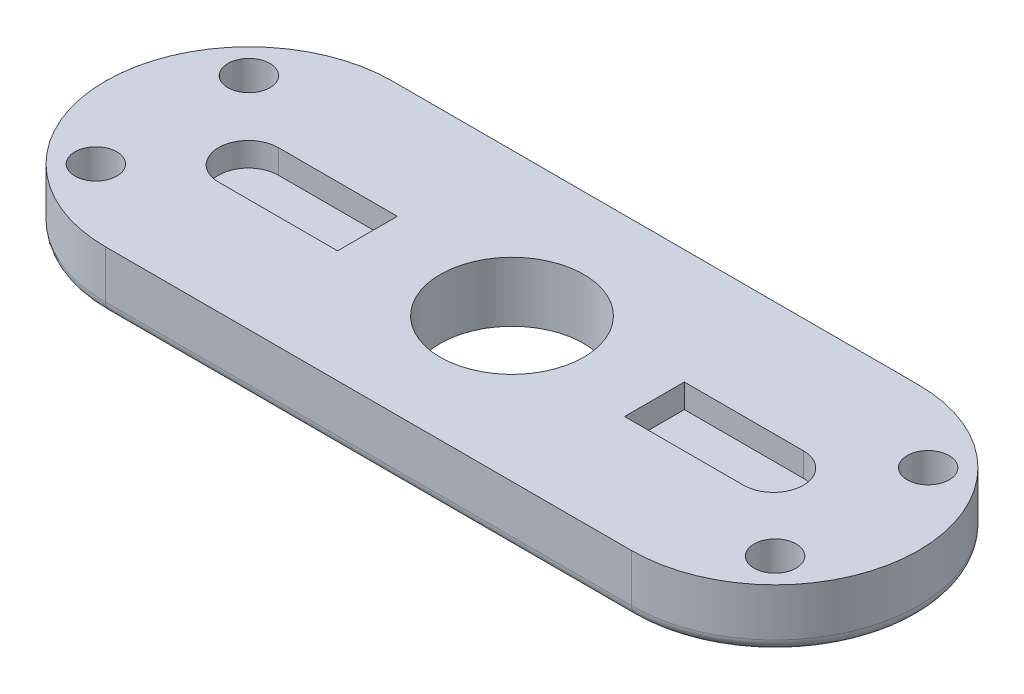
ISO-10303-21;
HEADER;
FILE_DESCRIPTION(('STEP AP214'),'2;1');
FILE_NAME('part.step','',(''),(''),'','','');
FILE_SCHEMA(('AUTOMOTIVE_DESIGN { 1 0 10303 214 1 1 1 1 }'));
ENDSEC;
DATA;
#1=APPLICATION_CONTEXT('core data for automotive mechanical design processes');
#2=APPLICATION_PROTOCOL_DEFINITION('international standard','automotive_design',2000,#1);
#3=PRODUCT_CONTEXT('',#1,'mechanical');
#4=PRODUCT('Part','Part','',(#3));
#5=PRODUCT_RELATED_PRODUCT_CATEGORY('part','',(#4));
#6=PRODUCT_DEFINITION_FORMATION('','',#4);
#7=PRODUCT_DEFINITION_CONTEXT('part definition',#1,'design');
#8=PRODUCT_DEFINITION('design','',#6,#7);
#9=PRODUCT_DEFINITION_SHAPE('','',#8);
#10=(LENGTH_UNIT() NAMED_UNIT(*) SI_UNIT(.MILLI.,.METRE.));
#11=(NAMED_UNIT(*) PLANE_ANGLE_UNIT() SI_UNIT($,.RADIAN.));
#12=(NAMED_UNIT(*) SI_UNIT($,.STERADIAN.) SOLID_ANGLE_UNIT());
#13=UNCERTAINTY_MEASURE_WITH_UNIT(LENGTH_MEASURE(1.E-05),#10,'distance_accuracy_value','');
#14=(GEOMETRIC_REPRESENTATION_CONTEXT(3) GLOBAL_UNCERTAINTY_ASSIGNED_CONTEXT((#13)) GLOBAL_UNIT_ASSIGNED_CONTEXT((#10,
#11,#12)) REPRESENTATION_CONTEXT('',''));
#15=CARTESIAN_POINT('',(0.,0.,0.));
#16=DIRECTION('',(0.,0.,1.));
#17=DIRECTION('',(1.,0.,0.));
#18=AXIS2_PLACEMENT_3D('',#15,#16,#17);
#19=CARTESIAN_POINT('',(-27.94,6.35,0.));
#20=DIRECTION('',(0.,-1.,0.));
#21=DIRECTION('',(0.,0.,-1.));
#22=AXIS2_PLACEMENT_3D('',#19,#20,#21);
#23=CYLINDRICAL_SURFACE('',#22,15.24);
#24=DIRECTION('',(0.,-1.,0.));
#25=VECTOR('',#24,1.);
#26=CARTESIAN_POINT('',(-27.94,6.35,-15.24));
#27=LINE('',#26,#25);
#28=CARTESIAN_POINT('',(-27.94,6.35,-15.24));
#29=VERTEX_POINT('',#28);
#30=CARTESIAN_POINT('',(-27.94,1.27,-15.24));
#31=VERTEX_POINT('',#30);
#32=EDGE_CURVE('E230',#29,#31,#27,.T.);
#33=ORIENTED_EDGE('',*,*,#32,.T.);
#34=CARTESIAN_POINT('',(-27.94,1.27,0.));
#35=DIRECTION('',(0.,1.,0.));
#36=DIRECTION('',(0.,0.,1.));
#37=AXIS2_PLACEMENT_3D('',#34,#35,#36);
#38=CIRCLE('',#37,15.24);
#39=CARTESIAN_POINT('',(-27.94,1.27,15.24));
#40=VERTEX_POINT('',#39);
#41=EDGE_CURVE('E236',#31,#40,#38,.T.);
#42=ORIENTED_EDGE('',*,*,#41,.T.);
#43=DIRECTION('',(0.,-1.,0.));
#44=VECTOR('',#43,1.);
#45=CARTESIAN_POINT('',(-27.94,6.35,15.24));
#46=LINE('',#45,#44);
#47=CARTESIAN_POINT('',(-27.94,6.35,15.24));
#48=VERTEX_POINT('',#47);
#49=EDGE_CURVE('E237',#48,#40,#46,.T.);
#50=ORIENTED_EDGE('',*,*,#49,.F.);
#51=CARTESIAN_POINT('',(-27.94,6.35,0.));
#52=DIRECTION('',(0.,1.,0.));
#53=DIRECTION('',(0.,0.,1.));
#54=AXIS2_PLACEMENT_3D('',#51,#52,#53);
#55=CIRCLE('',#54,15.24);
#56=EDGE_CURVE('E183',#29,#48,#55,.T.);
#57=ORIENTED_EDGE('',*,*,#56,.F.);
#58=EDGE_LOOP('',(#33,#42,#50,#57));
#59=FACE_BOUND('',#58,.T.);
#60=ADVANCED_FACE('F39',(#59),#23,.T.);
#61=CARTESIAN_POINT('',(-27.94,6.35,15.24));
#62=DIRECTION('',(0.,0.,-1.));
#63=DIRECTION('',(-1.,0.,0.));
#64=AXIS2_PLACEMENT_3D('',#61,#62,#63);
#65=PLANE('',#64);
#66=ORIENTED_EDGE('',*,*,#49,.T.);
#67=DIRECTION('',(1.,0.,0.));
#68=VECTOR('',#67,1.);
#69=CARTESIAN_POINT('',(-27.94,1.27,15.24));
#70=LINE('',#69,#68);
#71=CARTESIAN_POINT('',(27.94,1.27,15.24));
#72=VERTEX_POINT('',#71);
#73=EDGE_CURVE('E11',#40,#72,#70,.T.);
#74=ORIENTED_EDGE('',*,*,#73,.T.);
#75=DIRECTION('',(0.,-1.,0.));
#76=VECTOR('',#75,1.);
#77=CARTESIAN_POINT('',(27.94,6.35,15.24));
#78=LINE('',#77,#76);
#79=CARTESIAN_POINT('',(27.94,6.35,15.24));
#80=VERTEX_POINT('',#79);
#81=EDGE_CURVE('E232',#80,#72,#78,.T.);
#82=ORIENTED_EDGE('',*,*,#81,.F.);
#83=DIRECTION('',(1.,0.,0.));
#84=VECTOR('',#83,1.);
#85=CARTESIAN_POINT('',(-27.94,6.35,15.24));
#86=LINE('',#85,#84);
#87=EDGE_CURVE('E224',#48,#80,#86,.T.);
#88=ORIENTED_EDGE('',*,*,#87,.F.);
#89=EDGE_LOOP('',(#66,#74,#82,#88));
#90=FACE_BOUND('',#89,.T.);
#91=ADVANCED_FACE('F325',(#90),#65,.F.);
#92=CARTESIAN_POINT('',(27.94,6.35,0.));
#93=DIRECTION('',(0.,-1.,0.));
#94=DIRECTION('',(0.,0.,-1.));
#95=AXIS2_PLACEMENT_3D('',#92,#93,#94);
#96=CYLINDRICAL_SURFACE('',#95,15.24);
#97=ORIENTED_EDGE('',*,*,#81,.T.);
#98=CARTESIAN_POINT('',(27.94,1.27,0.));
#99=DIRECTION('',(0.,1.,0.));
#100=DIRECTION('',(0.,0.,1.));
#101=AXIS2_PLACEMENT_3D('',#98,#99,#100);
#102=CIRCLE('',#101,15.24);
#103=CARTESIAN_POINT('',(27.94,1.27,-15.24));
#104=VERTEX_POINT('',#103);
#105=EDGE_CURVE('E48',#72,#104,#102,.T.);
#106=ORIENTED_EDGE('',*,*,#105,.T.);
#107=DIRECTION('',(0.,-1.,0.));
#108=VECTOR('',#107,1.);
#109=CARTESIAN_POINT('',(27.94,6.35,-15.24));
#110=LINE('',#109,#108);
#111=CARTESIAN_POINT('',(27.94,6.35,-15.24));
#112=VERTEX_POINT('',#111);
#113=EDGE_CURVE('E235',#112,#104,#110,.T.);
#114=ORIENTED_EDGE('',*,*,#113,.F.);
#115=CARTESIAN_POINT('',(27.94,6.35,0.));
#116=DIRECTION('',(0.,1.,0.));
#117=DIRECTION('',(0.,0.,-1.));
#118=AXIS2_PLACEMENT_3D('',#115,#116,#117);
#119=CIRCLE('',#118,15.24);
#120=EDGE_CURVE('E223',#80,#112,#119,.T.);
#121=ORIENTED_EDGE('',*,*,#120,.F.);
#122=EDGE_LOOP('',(#97,#106,#114,#121));
#123=FACE_BOUND('',#122,.T.);
#124=ADVANCED_FACE('F322',(#123),#96,.T.);
#125=CARTESIAN_POINT('',(27.94,6.35,-15.24));
#126=DIRECTION('',(0.,0.,1.));
#127=DIRECTION('',(1.,0.,0.));
#128=AXIS2_PLACEMENT_3D('',#125,#126,#127);
#129=PLANE('',#128);
#130=ORIENTED_EDGE('',*,*,#113,.T.);
#131=DIRECTION('',(-1.,0.,0.));
#132=VECTOR('',#131,1.);
#133=CARTESIAN_POINT('',(27.94,1.27,-15.24));
#134=LINE('',#133,#132);
#135=EDGE_CURVE('E249',#104,#31,#134,.T.);
#136=ORIENTED_EDGE('',*,*,#135,.T.);
#137=ORIENTED_EDGE('',*,*,#32,.F.);
#138=DIRECTION('',(-1.,0.,0.));
#139=VECTOR('',#138,1.);
#140=CARTESIAN_POINT('',(27.94,6.35,-15.24));
#141=LINE('',#140,#139);
#142=EDGE_CURVE('E229',#112,#29,#141,.T.);
#143=ORIENTED_EDGE('',*,*,#142,.F.);
#144=EDGE_LOOP('',(#130,#136,#137,#143));
#145=FACE_BOUND('',#144,.T.);
#146=ADVANCED_FACE('F302',(#145),#129,.F.);
#147=CARTESIAN_POINT('',(-27.94,6.35,0.));
#148=DIRECTION('',(0.,1.,0.));
#149=DIRECTION('',(0.,0.,1.));
#150=AXIS2_PLACEMENT_3D('',#147,#148,#149);
#151=PLANE('',#150);
#152=CARTESIAN_POINT('',(-36.068,6.35,8.12800000000001));
#153=DIRECTION('',(0.,1.,0.));
#154=DIRECTION('',(0.,0.,1.));
#155=AXIS2_PLACEMENT_3D('',#152,#153,#154);
#156=CIRCLE('',#155,2.23393);
#157=CARTESIAN_POINT('',(-36.068,6.35,10.36193));
#158=VERTEX_POINT('',#157);
#159=EDGE_CURVE('E280',#158,#158,#156,.T.);
#160=ORIENTED_EDGE('',*,*,#159,.F.);
#161=EDGE_LOOP('',(#160));
#162=FACE_BOUND('',#161,.T.);
#163=CARTESIAN_POINT('',(36.068,6.35,-8.12799999999998));
#164=DIRECTION('',(0.,1.,0.));
#165=DIRECTION('',(0.,0.,-1.));
#166=AXIS2_PLACEMENT_3D('',#163,#164,#165);
#167=CIRCLE('',#166,2.23393);
#168=CARTESIAN_POINT('',(36.068,6.35,-10.36193));
#169=VERTEX_POINT('',#168);
#170=EDGE_CURVE('E282',#169,#169,#167,.T.);
#171=ORIENTED_EDGE('',*,*,#170,.F.);
#172=EDGE_LOOP('',(#171));
#173=FACE_BOUND('',#172,.T.);
#174=CARTESIAN_POINT('',(36.068,6.35,8.12800000000002));
#175=DIRECTION('',(0.,1.,0.));
#176=DIRECTION('',(0.,0.,-1.));
#177=AXIS2_PLACEMENT_3D('',#174,#175,#176);
#178=CIRCLE('',#177,2.23393);
#179=CARTESIAN_POINT('',(36.068,6.35,5.89407000000002));
#180=VERTEX_POINT('',#179);
#181=EDGE_CURVE('E285',#180,#180,#178,.T.);
#182=ORIENTED_EDGE('',*,*,#181,.F.);
#183=EDGE_LOOP('',(#182));
#184=FACE_BOUND('',#183,.T.);
#185=CARTESIAN_POINT('',(-36.068,6.35,-8.12799999999999));
#186=DIRECTION('',(0.,1.,0.));
#187=DIRECTION('',(0.,0.,1.));
#188=AXIS2_PLACEMENT_3D('',#185,#186,#187);
#189=CIRCLE('',#188,2.23393);
#190=CARTESIAN_POINT('',(-36.068,6.35,-5.89406999999999));
#191=VERTEX_POINT('',#190);
#192=EDGE_CURVE('E273',#191,#191,#189,.T.);
#193=ORIENTED_EDGE('',*,*,#192,.F.);
#194=EDGE_LOOP('',(#193));
#195=FACE_BOUND('',#194,.T.);
#196=CARTESIAN_POINT('',(0.,6.35,0.));
#197=DIRECTION('',(0.,1.,0.));
#198=DIRECTION('',(0.,0.,1.));
#199=AXIS2_PLACEMENT_3D('',#196,#197,#198);
#200=CIRCLE('',#199,7.62);
#201=CARTESIAN_POINT('',(0.,6.35,7.62));
#202=VERTEX_POINT('',#201);
#203=EDGE_CURVE('E174',#202,#202,#200,.T.);
#204=ORIENTED_EDGE('',*,*,#203,.F.);
#205=EDGE_LOOP('',(#204));
#206=FACE_BOUND('',#205,.T.);
#207=DIRECTION('',(0.,0.,-1.));
#208=VECTOR('',#207,1.);
#209=CARTESIAN_POINT('',(-15.24,6.35,-3.06344035864105));
#210=LINE('',#209,#208);
#211=CARTESIAN_POINT('',(-15.24,6.35,3.28655964135895));
#212=VERTEX_POINT('',#211);
#213=CARTESIAN_POINT('',(-15.24,6.35,-3.06344035864105));
#214=VERTEX_POINT('',#213);
#215=EDGE_CURVE('E149',#212,#214,#210,.T.);
#216=ORIENTED_EDGE('',*,*,#215,.F.);
#217=DIRECTION('',(1.,0.,0.));
#218=VECTOR('',#217,1.);
#219=CARTESIAN_POINT('',(-15.24,6.35,3.28655964135895));
#220=LINE('',#219,#218);
#221=CARTESIAN_POINT('',(-27.8827479250778,6.35,3.28655964135895));
#222=VERTEX_POINT('',#221);
#223=EDGE_CURVE('E167',#222,#212,#220,.T.);
#224=ORIENTED_EDGE('',*,*,#223,.F.);
#225=CARTESIAN_POINT('',(-27.8827479250778,6.35,0.111559641358953));
#226=DIRECTION('',(0.,1.,0.));
#227=DIRECTION('',(0.,0.,1.));
#228=AXIS2_PLACEMENT_3D('',#225,#226,#227);
#229=CIRCLE('',#228,3.175);
#230=CARTESIAN_POINT('',(-27.8827479250778,6.35,-3.06344035864104));
#231=VERTEX_POINT('',#230);
#232=EDGE_CURVE('E166',#231,#222,#229,.T.);
#233=ORIENTED_EDGE('',*,*,#232,.F.);
#234=DIRECTION('',(-1.,0.,0.));
#235=VECTOR('',#234,1.);
#236=CARTESIAN_POINT('',(-15.24,6.35,-3.06344035864105));
#237=LINE('',#236,#235);
#238=EDGE_CURVE('E176',#214,#231,#237,.T.);
#239=ORIENTED_EDGE('',*,*,#238,.F.);
#240=EDGE_LOOP('',(#216,#224,#233,#239));
#241=FACE_BOUND('',#240,.T.);
#242=DIRECTION('',(-1.,0.,0.));
#243=VECTOR('',#242,1.);
#244=CARTESIAN_POINT('',(15.24,6.35,-3.06344035864106));
#245=LINE('',#244,#243);
#246=CARTESIAN_POINT('',(27.8827479250778,6.35,-3.06344035864106));
#247=VERTEX_POINT('',#246);
#248=CARTESIAN_POINT('',(15.24,6.35,-3.06344035864106));
#249=VERTEX_POINT('',#248);
#250=EDGE_CURVE('E177',#247,#249,#245,.T.);
#251=ORIENTED_EDGE('',*,*,#250,.F.);
#252=CARTESIAN_POINT('',(27.8827479250778,6.35,0.11155964135894));
#253=DIRECTION('',(0.,1.,0.));
#254=DIRECTION('',(0.,0.,-1.));
#255=AXIS2_PLACEMENT_3D('',#252,#253,#254);
#256=CIRCLE('',#255,3.175);
#257=CARTESIAN_POINT('',(27.8827479250778,6.35,3.28655964135894));
#258=VERTEX_POINT('',#257);
#259=EDGE_CURVE('E199',#258,#247,#256,.T.);
#260=ORIENTED_EDGE('',*,*,#259,.F.);
#261=DIRECTION('',(1.,0.,0.));
#262=VECTOR('',#261,1.);
#263=CARTESIAN_POINT('',(15.24,6.35,3.28655964135895));
#264=LINE('',#263,#262);
#265=CARTESIAN_POINT('',(15.24,6.35,3.28655964135895));
#266=VERTEX_POINT('',#265);
#267=EDGE_CURVE('E201',#266,#258,#264,.T.);
#268=ORIENTED_EDGE('',*,*,#267,.F.);
#269=DIRECTION('',(0.,0.,1.));
#270=VECTOR('',#269,1.);
#271=CARTESIAN_POINT('',(15.24,6.35,-3.06344035864106));
#272=LINE('',#271,#270);
#273=EDGE_CURVE('E210',#249,#266,#272,.T.);
#274=ORIENTED_EDGE('',*,*,#273,.F.);
#275=EDGE_LOOP('',(#251,#260,#268,#274));
#276=FACE_BOUND('',#275,.T.);
#277=ORIENTED_EDGE('',*,*,#56,.T.);
#278=ORIENTED_EDGE('',*,*,#87,.T.);
#279=ORIENTED_EDGE('',*,*,#120,.T.);
#280=ORIENTED_EDGE('',*,*,#142,.T.);
#281=EDGE_LOOP('',(#277,#278,#279,#280));
#282=FACE_BOUND('',#281,.T.);
#283=ADVANCED_FACE('F296',(#162,#173,#184,#195,#206,#241,#276,#282),#151,.T.);
#284=CARTESIAN_POINT('',(-27.94,0.,0.));
#285=DIRECTION('',(0.,1.,0.));
#286=DIRECTION('',(0.,0.,1.));
#287=AXIS2_PLACEMENT_3D('',#284,#285,#286);
#288=PLANE('',#287);
#289=CARTESIAN_POINT('',(-36.068,0.,8.12800000000001));
#290=DIRECTION('',(0.,1.,0.));
#291=DIRECTION('',(0.,0.,1.));
#292=AXIS2_PLACEMENT_3D('',#289,#290,#291);
#293=CIRCLE('',#292,2.23393);
#294=CARTESIAN_POINT('',(-36.068,0.,10.36193));
#295=VERTEX_POINT('',#294);
#296=EDGE_CURVE('E290',#295,#295,#293,.T.);
#297=ORIENTED_EDGE('',*,*,#296,.T.);
#298=EDGE_LOOP('',(#297));
#299=FACE_BOUND('',#298,.T.);
#300=CARTESIAN_POINT('',(36.068,0.,-8.12799999999998));
#301=DIRECTION('',(0.,1.,0.));
#302=DIRECTION('',(0.,0.,-1.));
#303=AXIS2_PLACEMENT_3D('',#300,#301,#302);
#304=CIRCLE('',#303,2.23393);
#305=CARTESIAN_POINT('',(36.068,0.,-10.36193));
#306=VERTEX_POINT('',#305);
#307=EDGE_CURVE('E278',#306,#306,#304,.T.);
#308=ORIENTED_EDGE('',*,*,#307,.T.);
#309=EDGE_LOOP('',(#308));
#310=FACE_BOUND('',#309,.T.);
#311=CARTESIAN_POINT('',(36.068,0.,8.12800000000002));
#312=DIRECTION('',(0.,1.,0.));
#313=DIRECTION('',(0.,0.,-1.));
#314=AXIS2_PLACEMENT_3D('',#311,#312,#313);
#315=CIRCLE('',#314,2.23393);
#316=CARTESIAN_POINT('',(36.068,0.,5.89407000000002));
#317=VERTEX_POINT('',#316);
#318=EDGE_CURVE('E295',#317,#317,#315,.T.);
#319=ORIENTED_EDGE('',*,*,#318,.T.);
#320=EDGE_LOOP('',(#319));
#321=FACE_BOUND('',#320,.T.);
#322=CARTESIAN_POINT('',(-36.068,0.,-8.12799999999999));
#323=DIRECTION('',(0.,1.,0.));
#324=DIRECTION('',(0.,0.,1.));
#325=AXIS2_PLACEMENT_3D('',#322,#323,#324);
#326=CIRCLE('',#325,2.23393);
#327=CARTESIAN_POINT('',(-36.068,0.,-5.89406999999999));
#328=VERTEX_POINT('',#327);
#329=EDGE_CURVE('E258',#328,#328,#326,.T.);
#330=ORIENTED_EDGE('',*,*,#329,.T.);
#331=EDGE_LOOP('',(#330));
#332=FACE_BOUND('',#331,.T.);
#333=DIRECTION('',(1.,0.,0.));
#334=VECTOR('',#333,1.);
#335=CARTESIAN_POINT('',(-27.94,0.,13.97));
#336=LINE('',#335,#334);
#337=CARTESIAN_POINT('',(27.94,0.,13.97));
#338=VERTEX_POINT('',#337);
#339=CARTESIAN_POINT('',(-27.94,0.,13.97));
#340=VERTEX_POINT('',#339);
#341=EDGE_CURVE('E243',#338,#340,#336,.F.);
#342=ORIENTED_EDGE('',*,*,#341,.T.);
#343=CARTESIAN_POINT('',(-27.94,0.,0.));
#344=DIRECTION('',(0.,1.,0.));
#345=DIRECTION('',(0.,0.,1.));
#346=AXIS2_PLACEMENT_3D('',#343,#344,#345);
#347=CIRCLE('',#346,13.97);
#348=CARTESIAN_POINT('',(-27.94,0.,-13.97));
#349=VERTEX_POINT('',#348);
#350=EDGE_CURVE('E250',#340,#349,#347,.F.);
#351=ORIENTED_EDGE('',*,*,#350,.T.);
#352=DIRECTION('',(-1.,0.,0.));
#353=VECTOR('',#352,1.);
#354=CARTESIAN_POINT('',(-27.94,0.,-13.97));
#355=LINE('',#354,#353);
#356=CARTESIAN_POINT('',(27.94,0.,-13.97));
#357=VERTEX_POINT('',#356);
#358=EDGE_CURVE('E241',#349,#357,#355,.F.);
#359=ORIENTED_EDGE('',*,*,#358,.T.);
#360=CARTESIAN_POINT('',(27.94,0.,0.));
#361=DIRECTION('',(0.,1.,0.));
#362=DIRECTION('',(0.,0.,1.));
#363=AXIS2_PLACEMENT_3D('',#360,#361,#362);
#364=CIRCLE('',#363,13.97);
#365=EDGE_CURVE('E242',#357,#338,#364,.F.);
#366=ORIENTED_EDGE('',*,*,#365,.T.);
#367=EDGE_LOOP('',(#342,#351,#359,#366));
#368=FACE_BOUND('',#367,.T.);
#369=CARTESIAN_POINT('',(0.,0.,0.));
#370=DIRECTION('',(0.,1.,0.));
#371=DIRECTION('',(0.,0.,1.));
#372=AXIS2_PLACEMENT_3D('',#369,#370,#371);
#373=CIRCLE('',#372,7.62);
#374=CARTESIAN_POINT('',(0.,0.,7.62));
#375=VERTEX_POINT('',#374);
#376=EDGE_CURVE('E200',#375,#375,#373,.T.);
#377=ORIENTED_EDGE('',*,*,#376,.T.);
#378=EDGE_LOOP('',(#377));
#379=FACE_BOUND('',#378,.T.);
#380=ADVANCED_FACE('F301',(#299,#310,#321,#332,#368,#379),#288,.F.);
#381=CARTESIAN_POINT('',(15.24,3.81,-3.06344035864106));
#382=DIRECTION('',(0.,0.,-1.));
#383=DIRECTION('',(-1.,0.,0.));
#384=AXIS2_PLACEMENT_3D('',#381,#382,#383);
#385=PLANE('',#384);
#386=ORIENTED_EDGE('',*,*,#250,.T.);
#387=DIRECTION('',(0.,1.,0.));
#388=VECTOR('',#387,1.);
#389=CARTESIAN_POINT('',(15.24,3.81,-3.06344035864106));
#390=LINE('',#389,#388);
#391=CARTESIAN_POINT('',(15.24,3.81,-3.06344035864106));
#392=VERTEX_POINT('',#391);
#393=EDGE_CURVE('E190',#392,#249,#390,.T.);
#394=ORIENTED_EDGE('',*,*,#393,.F.);
#395=DIRECTION('',(-1.,0.,0.));
#396=VECTOR('',#395,1.);
#397=CARTESIAN_POINT('',(15.24,3.81,-3.06344035864106));
#398=LINE('',#397,#396);
#399=CARTESIAN_POINT('',(27.8827479250778,3.81,-3.06344035864106));
#400=VERTEX_POINT('',#399);
#401=EDGE_CURVE('E204',#400,#392,#398,.T.);
#402=ORIENTED_EDGE('',*,*,#401,.F.);
#403=DIRECTION('',(0.,1.,0.));
#404=VECTOR('',#403,1.);
#405=CARTESIAN_POINT('',(27.8827479250778,3.81,-3.06344035864106));
#406=LINE('',#405,#404);
#407=EDGE_CURVE('E197',#400,#247,#406,.T.);
#408=ORIENTED_EDGE('',*,*,#407,.T.);
#409=EDGE_LOOP('',(#386,#394,#402,#408));
#410=FACE_BOUND('',#409,.T.);
#411=ADVANCED_FACE('F355',(#410),#385,.F.);
#412=CARTESIAN_POINT('',(27.8827479250778,3.81,0.11155964135894));
#413=DIRECTION('',(0.,1.,0.));
#414=DIRECTION('',(0.,0.,1.));
#415=AXIS2_PLACEMENT_3D('',#412,#413,#414);
#416=CYLINDRICAL_SURFACE('',#415,3.175);
#417=ORIENTED_EDGE('',*,*,#259,.T.);
#418=ORIENTED_EDGE('',*,*,#407,.F.);
#419=CARTESIAN_POINT('',(27.8827479250778,3.81,0.11155964135894));
#420=DIRECTION('',(0.,1.,0.));
#421=DIRECTION('',(0.,0.,-1.));
#422=AXIS2_PLACEMENT_3D('',#419,#420,#421);
#423=CIRCLE('',#422,3.175);
#424=CARTESIAN_POINT('',(27.8827479250778,3.81,3.28655964135894));
#425=VERTEX_POINT('',#424);
#426=EDGE_CURVE('E195',#425,#400,#423,.T.);
#427=ORIENTED_EDGE('',*,*,#426,.F.);
#428=DIRECTION('',(0.,1.,0.));
#429=VECTOR('',#428,1.);
#430=CARTESIAN_POINT('',(27.8827479250778,3.81,3.28655964135894));
#431=LINE('',#430,#429);
#432=EDGE_CURVE('E194',#425,#258,#431,.T.);
#433=ORIENTED_EDGE('',*,*,#432,.T.);
#434=EDGE_LOOP('',(#417,#418,#427,#433));
#435=FACE_BOUND('',#434,.T.);
#436=ADVANCED_FACE('F362',(#435),#416,.F.);
#437=CARTESIAN_POINT('',(15.24,3.81,3.28655964135895));
#438=DIRECTION('',(0.,0.,1.));
#439=DIRECTION('',(1.,0.,0.));
#440=AXIS2_PLACEMENT_3D('',#437,#438,#439);
#441=PLANE('',#440);
#442=ORIENTED_EDGE('',*,*,#267,.T.);
#443=ORIENTED_EDGE('',*,*,#432,.F.);
#444=DIRECTION('',(1.,0.,0.));
#445=VECTOR('',#444,1.);
#446=CARTESIAN_POINT('',(15.24,3.81,3.28655964135895));
#447=LINE('',#446,#445);
#448=CARTESIAN_POINT('',(15.24,3.81,3.28655964135895));
#449=VERTEX_POINT('',#448);
#450=EDGE_CURVE('E213',#449,#425,#447,.T.);
#451=ORIENTED_EDGE('',*,*,#450,.F.);
#452=DIRECTION('',(0.,1.,0.));
#453=VECTOR('',#452,1.);
#454=CARTESIAN_POINT('',(15.24,3.81,3.28655964135895));
#455=LINE('',#454,#453);
#456=EDGE_CURVE('E191',#449,#266,#455,.T.);
#457=ORIENTED_EDGE('',*,*,#456,.T.);
#458=EDGE_LOOP('',(#442,#443,#451,#457));
#459=FACE_BOUND('',#458,.T.);
#460=ADVANCED_FACE('F364',(#459),#441,.F.);
#461=CARTESIAN_POINT('',(15.24,3.81,-3.06344035864106));
#462=DIRECTION('',(-1.,0.,0.));
#463=DIRECTION('',(0.,0.,1.));
#464=AXIS2_PLACEMENT_3D('',#461,#462,#463);
#465=PLANE('',#464);
#466=ORIENTED_EDGE('',*,*,#273,.T.);
#467=ORIENTED_EDGE('',*,*,#456,.F.);
#468=DIRECTION('',(0.,0.,1.));
#469=VECTOR('',#468,1.);
#470=CARTESIAN_POINT('',(15.24,3.81,-3.06344035864106));
#471=LINE('',#470,#469);
#472=EDGE_CURVE('E216',#392,#449,#471,.T.);
#473=ORIENTED_EDGE('',*,*,#472,.F.);
#474=ORIENTED_EDGE('',*,*,#393,.T.);
#475=EDGE_LOOP('',(#466,#467,#473,#474));
#476=FACE_BOUND('',#475,.T.);
#477=ADVANCED_FACE('F359',(#476),#465,.F.);
#478=CARTESIAN_POINT('',(27.8827479250778,3.81,0.11155964135894));
#479=DIRECTION('',(0.,-1.,0.));
#480=DIRECTION('',(0.,0.,-1.));
#481=AXIS2_PLACEMENT_3D('',#478,#479,#480);
#482=PLANE('',#481);
#483=ORIENTED_EDGE('',*,*,#401,.T.);
#484=ORIENTED_EDGE('',*,*,#472,.T.);
#485=ORIENTED_EDGE('',*,*,#450,.T.);
#486=ORIENTED_EDGE('',*,*,#426,.T.);
#487=EDGE_LOOP('',(#483,#484,#485,#486));
#488=FACE_BOUND('',#487,.T.);
#489=ADVANCED_FACE('F360',(#488),#482,.F.);
#490=CARTESIAN_POINT('',(-15.24,3.81,-3.06344035864105));
#491=DIRECTION('',(1.,0.,0.));
#492=DIRECTION('',(0.,0.,-1.));
#493=AXIS2_PLACEMENT_3D('',#490,#491,#492);
#494=PLANE('',#493);
#495=ORIENTED_EDGE('',*,*,#215,.T.);
#496=DIRECTION('',(0.,1.,0.));
#497=VECTOR('',#496,1.);
#498=CARTESIAN_POINT('',(-15.24,3.81,-3.06344035864105));
#499=LINE('',#498,#497);
#500=CARTESIAN_POINT('',(-15.24,3.81,-3.06344035864105));
#501=VERTEX_POINT('',#500);
#502=EDGE_CURVE('E142',#501,#214,#499,.T.);
#503=ORIENTED_EDGE('',*,*,#502,.F.);
#504=DIRECTION('',(0.,0.,-1.));
#505=VECTOR('',#504,1.);
#506=CARTESIAN_POINT('',(-15.24,3.81,-3.06344035864105));
#507=LINE('',#506,#505);
#508=CARTESIAN_POINT('',(-15.24,3.81,3.28655964135895));
#509=VERTEX_POINT('',#508);
#510=EDGE_CURVE('E148',#509,#501,#507,.T.);
#511=ORIENTED_EDGE('',*,*,#510,.F.);
#512=DIRECTION('',(0.,1.,0.));
#513=VECTOR('',#512,1.);
#514=CARTESIAN_POINT('',(-15.24,3.81,3.28655964135895));
#515=LINE('',#514,#513);
#516=EDGE_CURVE('E181',#509,#212,#515,.T.);
#517=ORIENTED_EDGE('',*,*,#516,.T.);
#518=EDGE_LOOP('',(#495,#503,#511,#517));
#519=FACE_BOUND('',#518,.T.);
#520=ADVANCED_FACE('F145',(#519),#494,.F.);
#521=CARTESIAN_POINT('',(-15.24,3.81,3.28655964135895));
#522=DIRECTION('',(0.,0.,1.));
#523=DIRECTION('',(1.,0.,0.));
#524=AXIS2_PLACEMENT_3D('',#521,#522,#523);
#525=PLANE('',#524);
#526=ORIENTED_EDGE('',*,*,#223,.T.);
#527=ORIENTED_EDGE('',*,*,#516,.F.);
#528=DIRECTION('',(1.,0.,0.));
#529=VECTOR('',#528,1.);
#530=CARTESIAN_POINT('',(-15.24,3.81,3.28655964135895));
#531=LINE('',#530,#529);
#532=CARTESIAN_POINT('',(-27.8827479250778,3.81,3.28655964135895));
#533=VERTEX_POINT('',#532);
#534=EDGE_CURVE('E152',#533,#509,#531,.T.);
#535=ORIENTED_EDGE('',*,*,#534,.F.);
#536=DIRECTION('',(0.,1.,0.));
#537=VECTOR('',#536,1.);
#538=CARTESIAN_POINT('',(-27.8827479250778,3.81,3.28655964135895));
#539=LINE('',#538,#537);
#540=EDGE_CURVE('E188',#533,#222,#539,.T.);
#541=ORIENTED_EDGE('',*,*,#540,.T.);
#542=EDGE_LOOP('',(#526,#527,#535,#541));
#543=FACE_BOUND('',#542,.T.);
#544=ADVANCED_FACE('F378',(#543),#525,.F.);
#545=CARTESIAN_POINT('',(-27.8827479250778,3.81,0.111559641358953));
#546=DIRECTION('',(0.,1.,0.));
#547=DIRECTION('',(0.,0.,1.));
#548=AXIS2_PLACEMENT_3D('',#545,#546,#547);
#549=CYLINDRICAL_SURFACE('',#548,3.175);
#550=ORIENTED_EDGE('',*,*,#232,.T.);
#551=ORIENTED_EDGE('',*,*,#540,.F.);
#552=CARTESIAN_POINT('',(-27.8827479250778,3.81,0.111559641358953));
#553=DIRECTION('',(0.,1.,0.));
#554=DIRECTION('',(0.,0.,1.));
#555=AXIS2_PLACEMENT_3D('',#552,#553,#554);
#556=CIRCLE('',#555,3.175);
#557=CARTESIAN_POINT('',(-27.8827479250778,3.81,-3.06344035864104));
#558=VERTEX_POINT('',#557);
#559=EDGE_CURVE('E165',#558,#533,#556,.T.);
#560=ORIENTED_EDGE('',*,*,#559,.F.);
#561=DIRECTION('',(0.,1.,0.));
#562=VECTOR('',#561,1.);
#563=CARTESIAN_POINT('',(-27.8827479250778,3.81,-3.06344035864104));
#564=LINE('',#563,#562);
#565=EDGE_CURVE('E153',#558,#231,#564,.T.);
#566=ORIENTED_EDGE('',*,*,#565,.T.);
#567=EDGE_LOOP('',(#550,#551,#560,#566));
#568=FACE_BOUND('',#567,.T.);
#569=ADVANCED_FACE('F381',(#568),#549,.F.);
#570=CARTESIAN_POINT('',(-15.24,3.81,-3.06344035864105));
#571=DIRECTION('',(0.,0.,-1.));
#572=DIRECTION('',(-1.,0.,0.));
#573=AXIS2_PLACEMENT_3D('',#570,#571,#572);
#574=PLANE('',#573);
#575=ORIENTED_EDGE('',*,*,#238,.T.);
#576=ORIENTED_EDGE('',*,*,#565,.F.);
#577=DIRECTION('',(-1.,0.,0.));
#578=VECTOR('',#577,1.);
#579=CARTESIAN_POINT('',(-15.24,3.81,-3.06344035864105));
#580=LINE('',#579,#578);
#581=EDGE_CURVE('E160',#501,#558,#580,.T.);
#582=ORIENTED_EDGE('',*,*,#581,.F.);
#583=ORIENTED_EDGE('',*,*,#502,.T.);
#584=EDGE_LOOP('',(#575,#576,#582,#583));
#585=FACE_BOUND('',#584,.T.);
#586=ADVANCED_FACE('F158',(#585),#574,.F.);
#587=CARTESIAN_POINT('',(-27.8827479250778,3.81,0.111559641358953));
#588=DIRECTION('',(0.,1.,0.));
#589=DIRECTION('',(0.,0.,1.));
#590=AXIS2_PLACEMENT_3D('',#587,#588,#589);
#591=PLANE('',#590);
#592=ORIENTED_EDGE('',*,*,#510,.T.);
#593=ORIENTED_EDGE('',*,*,#581,.T.);
#594=ORIENTED_EDGE('',*,*,#559,.T.);
#595=ORIENTED_EDGE('',*,*,#534,.T.);
#596=EDGE_LOOP('',(#592,#593,#594,#595));
#597=FACE_BOUND('',#596,.T.);
#598=ADVANCED_FACE('F163',(#597),#591,.T.);
#599=CARTESIAN_POINT('',(0.,0.,0.));
#600=DIRECTION('',(0.,1.,0.));
#601=DIRECTION('',(0.,0.,1.));
#602=AXIS2_PLACEMENT_3D('',#599,#600,#601);
#603=CYLINDRICAL_SURFACE('',#602,7.62);
#604=ORIENTED_EDGE('',*,*,#376,.F.);
#605=EDGE_LOOP('',(#604));
#606=FACE_BOUND('',#605,.T.);
#607=ORIENTED_EDGE('',*,*,#203,.T.);
#608=EDGE_LOOP('',(#607));
#609=FACE_BOUND('',#608,.T.);
#610=ADVANCED_FACE('F388',(#606,#609),#603,.F.);
#611=CARTESIAN_POINT('',(27.94,1.27,0.));
#612=DIRECTION('',(0.,1.,0.));
#613=DIRECTION('',(0.,0.,1.));
#614=AXIS2_PLACEMENT_3D('',#611,#612,#613);
#615=TOROIDAL_SURFACE('',#614,13.97,1.27);
#616=CARTESIAN_POINT('',(27.94,1.27,13.97));
#617=DIRECTION('',(-1.,0.,0.));
#618=DIRECTION('',(0.,0.,1.));
#619=AXIS2_PLACEMENT_3D('',#616,#617,#618);
#620=CIRCLE('',#619,1.27);
#621=EDGE_CURVE('E260',#338,#72,#620,.T.);
#622=ORIENTED_EDGE('',*,*,#621,.F.);
#623=ORIENTED_EDGE('',*,*,#365,.F.);
#624=CARTESIAN_POINT('',(27.94,1.27,-13.97));
#625=DIRECTION('',(-1.,0.,0.));
#626=DIRECTION('',(0.,0.,1.));
#627=AXIS2_PLACEMENT_3D('',#624,#625,#626);
#628=CIRCLE('',#627,1.27);
#629=EDGE_CURVE('E43',#104,#357,#628,.T.);
#630=ORIENTED_EDGE('',*,*,#629,.F.);
#631=ORIENTED_EDGE('',*,*,#105,.F.);
#632=EDGE_LOOP('',(#622,#623,#630,#631));
#633=FACE_BOUND('',#632,.T.);
#634=ADVANCED_FACE('F41',(#633),#615,.T.);
#635=CARTESIAN_POINT('',(27.94,1.27,-13.97));
#636=DIRECTION('',(-1.,0.,0.));
#637=DIRECTION('',(0.,0.,1.));
#638=AXIS2_PLACEMENT_3D('',#635,#636,#637);
#639=CYLINDRICAL_SURFACE('',#638,1.27);
#640=ORIENTED_EDGE('',*,*,#629,.T.);
#641=ORIENTED_EDGE('',*,*,#358,.F.);
#642=CARTESIAN_POINT('',(-27.94,1.27,-13.97));
#643=DIRECTION('',(-1.,0.,0.));
#644=DIRECTION('',(0.,0.,1.));
#645=AXIS2_PLACEMENT_3D('',#642,#643,#644);
#646=CIRCLE('',#645,1.27);
#647=EDGE_CURVE('E254',#31,#349,#646,.T.);
#648=ORIENTED_EDGE('',*,*,#647,.F.);
#649=ORIENTED_EDGE('',*,*,#135,.F.);
#650=EDGE_LOOP('',(#640,#641,#648,#649));
#651=FACE_BOUND('',#650,.T.);
#652=ADVANCED_FACE('F330',(#651),#639,.T.);
#653=CARTESIAN_POINT('',(-27.94,1.27,13.97));
#654=DIRECTION('',(1.,0.,0.));
#655=DIRECTION('',(0.,0.,-1.));
#656=AXIS2_PLACEMENT_3D('',#653,#654,#655);
#657=CYLINDRICAL_SURFACE('',#656,1.27);
#658=ORIENTED_EDGE('',*,*,#621,.T.);
#659=ORIENTED_EDGE('',*,*,#73,.F.);
#660=CARTESIAN_POINT('',(-27.94,1.27,13.97));
#661=DIRECTION('',(-1.,0.,0.));
#662=DIRECTION('',(0.,0.,1.));
#663=AXIS2_PLACEMENT_3D('',#660,#661,#662);
#664=CIRCLE('',#663,1.27);
#665=EDGE_CURVE('E251',#340,#40,#664,.T.);
#666=ORIENTED_EDGE('',*,*,#665,.F.);
#667=ORIENTED_EDGE('',*,*,#341,.F.);
#668=EDGE_LOOP('',(#658,#659,#666,#667));
#669=FACE_BOUND('',#668,.T.);
#670=ADVANCED_FACE('F335',(#669),#657,.T.);
#671=CARTESIAN_POINT('',(-27.94,1.27,0.));
#672=DIRECTION('',(0.,1.,0.));
#673=DIRECTION('',(0.,0.,1.));
#674=AXIS2_PLACEMENT_3D('',#671,#672,#673);
#675=TOROIDAL_SURFACE('',#674,13.97,1.27);
#676=ORIENTED_EDGE('',*,*,#647,.T.);
#677=ORIENTED_EDGE('',*,*,#350,.F.);
#678=ORIENTED_EDGE('',*,*,#665,.T.);
#679=ORIENTED_EDGE('',*,*,#41,.F.);
#680=EDGE_LOOP('',(#676,#677,#678,#679));
#681=FACE_BOUND('',#680,.T.);
#682=ADVANCED_FACE('F329',(#681),#675,.T.);
#683=CARTESIAN_POINT('',(-36.068,0.,-8.12799999999999));
#684=DIRECTION('',(0.,1.,0.));
#685=DIRECTION('',(0.,0.,1.));
#686=AXIS2_PLACEMENT_3D('',#683,#684,#685);
#687=CYLINDRICAL_SURFACE('',#686,2.23393);
#688=ORIENTED_EDGE('',*,*,#329,.F.);
#689=EDGE_LOOP('',(#688));
#690=FACE_BOUND('',#689,.T.);
#691=ORIENTED_EDGE('',*,*,#192,.T.);
#692=EDGE_LOOP('',(#691));
#693=FACE_BOUND('',#692,.T.);
#694=ADVANCED_FACE('F340',(#690,#693),#687,.F.);
#695=CARTESIAN_POINT('',(36.068,0.,8.12800000000002));
#696=DIRECTION('',(0.,1.,0.));
#697=DIRECTION('',(0.,0.,1.));
#698=AXIS2_PLACEMENT_3D('',#695,#696,#697);
#699=CYLINDRICAL_SURFACE('',#698,2.23393);
#700=ORIENTED_EDGE('',*,*,#318,.F.);
#701=EDGE_LOOP('',(#700));
#702=FACE_BOUND('',#701,.T.);
#703=ORIENTED_EDGE('',*,*,#181,.T.);
#704=EDGE_LOOP('',(#703));
#705=FACE_BOUND('',#704,.T.);
#706=ADVANCED_FACE('F297',(#702,#705),#699,.F.);
#707=CARTESIAN_POINT('',(36.068,0.,-8.12799999999998));
#708=DIRECTION('',(0.,1.,0.));
#709=DIRECTION('',(0.,0.,1.));
#710=AXIS2_PLACEMENT_3D('',#707,#708,#709);
#711=CYLINDRICAL_SURFACE('',#710,2.23393);
#712=ORIENTED_EDGE('',*,*,#307,.F.);
#713=EDGE_LOOP('',(#712));
#714=FACE_BOUND('',#713,.T.);
#715=ORIENTED_EDGE('',*,*,#170,.T.);
#716=EDGE_LOOP('',(#715));
#717=FACE_BOUND('',#716,.T.);
#718=ADVANCED_FACE('F398',(#714,#717),#711,.F.);
#719=CARTESIAN_POINT('',(-36.068,0.,8.12800000000001));
#720=DIRECTION('',(0.,1.,0.));
#721=DIRECTION('',(0.,0.,1.));
#722=AXIS2_PLACEMENT_3D('',#719,#720,#721);
#723=CYLINDRICAL_SURFACE('',#722,2.23393);
#724=ORIENTED_EDGE('',*,*,#296,.F.);
#725=EDGE_LOOP('',(#724));
#726=FACE_BOUND('',#725,.T.);
#727=ORIENTED_EDGE('',*,*,#159,.T.);
#728=EDGE_LOOP('',(#727));
#729=FACE_BOUND('',#728,.T.);
#730=ADVANCED_FACE('F397',(#726,#729),#723,.F.);
#731=CLOSED_SHELL('',(#60,#91,#124,#146,#283,#380,#411,#436,#460,#477,#489,#520,#544,#569,#586,
#598,#610,#634,#652,#670,#682,#694,#706,#718,#730));
#732=MANIFOLD_SOLID_BREP('B2',#731);
#733=ADVANCED_BREP_SHAPE_REPRESENTATION('',(#18,#732),#14);
#734=SHAPE_DEFINITION_REPRESENTATION(#9,#733);
ENDSEC;
END-ISO-10303-21;
